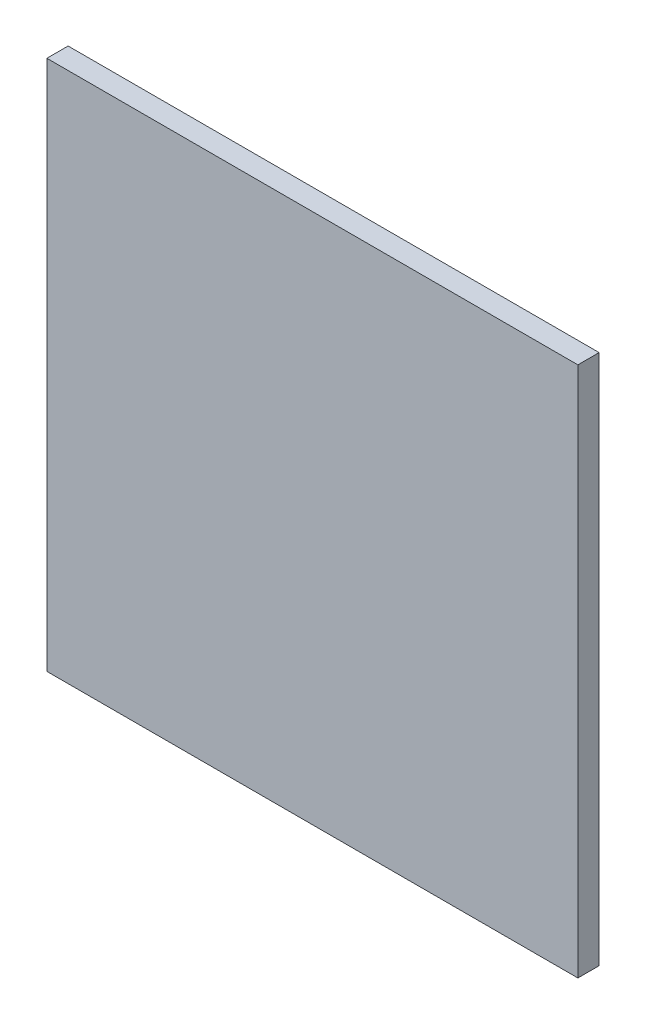
ISO-10303-21;
HEADER;
FILE_DESCRIPTION(('STEP AP214'),'2;1');
FILE_NAME('part.step','',(''),(''),'','','');
FILE_SCHEMA(('AUTOMOTIVE_DESIGN { 1 0 10303 214 1 1 1 1 }'));
ENDSEC;
DATA;
#1=APPLICATION_CONTEXT('core data for automotive mechanical design processes');
#2=APPLICATION_PROTOCOL_DEFINITION('international standard','automotive_design',2000,#1);
#3=PRODUCT_CONTEXT('',#1,'mechanical');
#4=PRODUCT('Part','Part','',(#3));
#5=PRODUCT_RELATED_PRODUCT_CATEGORY('part','',(#4));
#6=PRODUCT_DEFINITION_FORMATION('','',#4);
#7=PRODUCT_DEFINITION_CONTEXT('part definition',#1,'design');
#8=PRODUCT_DEFINITION('design','',#6,#7);
#9=PRODUCT_DEFINITION_SHAPE('','',#8);
#10=(LENGTH_UNIT() NAMED_UNIT(*) SI_UNIT(.MILLI.,.METRE.));
#11=(NAMED_UNIT(*) PLANE_ANGLE_UNIT() SI_UNIT($,.RADIAN.));
#12=(NAMED_UNIT(*) SI_UNIT($,.STERADIAN.) SOLID_ANGLE_UNIT());
#13=UNCERTAINTY_MEASURE_WITH_UNIT(LENGTH_MEASURE(1.E-05),#10,'distance_accuracy_value','');
#14=(GEOMETRIC_REPRESENTATION_CONTEXT(3) GLOBAL_UNCERTAINTY_ASSIGNED_CONTEXT((#13)) GLOBAL_UNIT_ASSIGNED_CONTEXT((#10,
#11,#12)) REPRESENTATION_CONTEXT('',''));
#15=CARTESIAN_POINT('',(0.,0.,0.));
#16=DIRECTION('',(0.,0.,1.));
#17=DIRECTION('',(1.,0.,0.));
#18=AXIS2_PLACEMENT_3D('',#15,#16,#17);
#19=CARTESIAN_POINT('',(-23.3223245614035,15.2333157894737,1.2));
#20=DIRECTION('',(1.,0.,0.));
#21=DIRECTION('',(0.,0.,-1.));
#22=AXIS2_PLACEMENT_3D('',#19,#20,#21);
#23=PLANE('',#22);
#24=DIRECTION('',(0.,-1.,0.));
#25=VECTOR('',#24,1.);
#26=CARTESIAN_POINT('',(-23.3223245614035,15.2333157894737,0.));
#27=LINE('',#26,#25);
#28=CARTESIAN_POINT('',(-23.3223245614035,15.2333157894737,0.));
#29=VERTEX_POINT('',#28);
#30=CARTESIAN_POINT('',(-23.3223245614035,-14.7666842105263,0.));
#31=VERTEX_POINT('',#30);
#32=EDGE_CURVE('E107',#29,#31,#27,.T.);
#33=ORIENTED_EDGE('',*,*,#32,.T.);
#34=DIRECTION('',(0.,0.,-1.));
#35=VECTOR('',#34,1.);
#36=CARTESIAN_POINT('',(-23.3223245614035,-14.7666842105263,1.2));
#37=LINE('',#36,#35);
#38=CARTESIAN_POINT('',(-23.3223245614035,-14.7666842105263,1.2));
#39=VERTEX_POINT('',#38);
#40=EDGE_CURVE('E11',#39,#31,#37,.T.);
#41=ORIENTED_EDGE('',*,*,#40,.F.);
#42=DIRECTION('',(0.,-1.,0.));
#43=VECTOR('',#42,1.);
#44=CARTESIAN_POINT('',(-23.3223245614035,15.2333157894737,1.2));
#45=LINE('',#44,#43);
#46=CARTESIAN_POINT('',(-23.3223245614035,15.2333157894737,1.2));
#47=VERTEX_POINT('',#46);
#48=EDGE_CURVE('E91',#47,#39,#45,.T.);
#49=ORIENTED_EDGE('',*,*,#48,.F.);
#50=DIRECTION('',(0.,0.,-1.));
#51=VECTOR('',#50,1.);
#52=CARTESIAN_POINT('',(-23.3223245614035,15.2333157894737,1.2));
#53=LINE('',#52,#51);
#54=EDGE_CURVE('E103',#47,#29,#53,.T.);
#55=ORIENTED_EDGE('',*,*,#54,.T.);
#56=EDGE_LOOP('',(#33,#41,#49,#55));
#57=FACE_BOUND('',#56,.T.);
#58=ADVANCED_FACE('F39',(#57),#23,.F.);
#59=CARTESIAN_POINT('',(-23.3223245614035,-14.7666842105263,1.2));
#60=DIRECTION('',(0.,1.,0.));
#61=DIRECTION('',(0.,0.,1.));
#62=AXIS2_PLACEMENT_3D('',#59,#60,#61);
#63=PLANE('',#62);
#64=DIRECTION('',(1.,0.,0.));
#65=VECTOR('',#64,1.);
#66=CARTESIAN_POINT('',(-23.3223245614035,-14.7666842105263,0.));
#67=LINE('',#66,#65);
#68=CARTESIAN_POINT('',(6.67767543859649,-14.7666842105263,0.));
#69=VERTEX_POINT('',#68);
#70=EDGE_CURVE('E96',#31,#69,#67,.T.);
#71=ORIENTED_EDGE('',*,*,#70,.T.);
#72=DIRECTION('',(0.,0.,-1.));
#73=VECTOR('',#72,1.);
#74=CARTESIAN_POINT('',(6.67767543859649,-14.7666842105263,1.2));
#75=LINE('',#74,#73);
#76=CARTESIAN_POINT('',(6.67767543859649,-14.7666842105263,1.2));
#77=VERTEX_POINT('',#76);
#78=EDGE_CURVE('E48',#77,#69,#75,.T.);
#79=ORIENTED_EDGE('',*,*,#78,.F.);
#80=DIRECTION('',(1.,0.,0.));
#81=VECTOR('',#80,1.);
#82=CARTESIAN_POINT('',(-23.3223245614035,-14.7666842105263,1.2));
#83=LINE('',#82,#81);
#84=EDGE_CURVE('E86',#39,#77,#83,.T.);
#85=ORIENTED_EDGE('',*,*,#84,.F.);
#86=ORIENTED_EDGE('',*,*,#40,.T.);
#87=EDGE_LOOP('',(#71,#79,#85,#86));
#88=FACE_BOUND('',#87,.T.);
#89=ADVANCED_FACE('F95',(#88),#63,.F.);
#90=CARTESIAN_POINT('',(6.67767543859649,15.2333157894737,1.2));
#91=DIRECTION('',(-1.,0.,0.));
#92=DIRECTION('',(0.,-1.,0.));
#93=AXIS2_PLACEMENT_3D('',#90,#91,#92);
#94=PLANE('',#93);
#95=DIRECTION('',(0.,1.,0.));
#96=VECTOR('',#95,1.);
#97=CARTESIAN_POINT('',(6.67767543859649,15.2333157894737,0.));
#98=LINE('',#97,#96);
#99=CARTESIAN_POINT('',(6.67767543859649,15.2333157894737,0.));
#100=VERTEX_POINT('',#99);
#101=EDGE_CURVE('E73',#69,#100,#98,.T.);
#102=ORIENTED_EDGE('',*,*,#101,.T.);
#103=DIRECTION('',(0.,0.,-1.));
#104=VECTOR('',#103,1.);
#105=CARTESIAN_POINT('',(6.67767543859649,15.2333157894737,1.2));
#106=LINE('',#105,#104);
#107=CARTESIAN_POINT('',(6.67767543859649,15.2333157894737,1.2));
#108=VERTEX_POINT('',#107);
#109=EDGE_CURVE('E98',#108,#100,#106,.T.);
#110=ORIENTED_EDGE('',*,*,#109,.F.);
#111=DIRECTION('',(0.,1.,0.));
#112=VECTOR('',#111,1.);
#113=CARTESIAN_POINT('',(6.67767543859649,15.2333157894737,1.2));
#114=LINE('',#113,#112);
#115=EDGE_CURVE('E89',#77,#108,#114,.T.);
#116=ORIENTED_EDGE('',*,*,#115,.F.);
#117=ORIENTED_EDGE('',*,*,#78,.T.);
#118=EDGE_LOOP('',(#102,#110,#116,#117));
#119=FACE_BOUND('',#118,.T.);
#120=ADVANCED_FACE('F99',(#119),#94,.F.);
#121=CARTESIAN_POINT('',(-23.3223245614035,15.2333157894737,1.2));
#122=DIRECTION('',(0.,-1.,0.));
#123=DIRECTION('',(0.,0.,-1.));
#124=AXIS2_PLACEMENT_3D('',#121,#122,#123);
#125=PLANE('',#124);
#126=DIRECTION('',(-1.,0.,0.));
#127=VECTOR('',#126,1.);
#128=CARTESIAN_POINT('',(-23.3223245614035,15.2333157894737,0.));
#129=LINE('',#128,#127);
#130=EDGE_CURVE('E79',#100,#29,#129,.T.);
#131=ORIENTED_EDGE('',*,*,#130,.T.);
#132=ORIENTED_EDGE('',*,*,#54,.F.);
#133=DIRECTION('',(-1.,0.,0.));
#134=VECTOR('',#133,1.);
#135=CARTESIAN_POINT('',(-23.3223245614035,15.2333157894737,1.2));
#136=LINE('',#135,#134);
#137=EDGE_CURVE('E56',#108,#47,#136,.T.);
#138=ORIENTED_EDGE('',*,*,#137,.F.);
#139=ORIENTED_EDGE('',*,*,#109,.T.);
#140=EDGE_LOOP('',(#131,#132,#138,#139));
#141=FACE_BOUND('',#140,.T.);
#142=ADVANCED_FACE('F120',(#141),#125,.F.);
#143=CARTESIAN_POINT('',(0.,0.,1.2));
#144=DIRECTION('',(0.,0.,1.));
#145=DIRECTION('',(1.,0.,0.));
#146=AXIS2_PLACEMENT_3D('',#143,#144,#145);
#147=PLANE('',#146);
#148=ORIENTED_EDGE('',*,*,#48,.T.);
#149=ORIENTED_EDGE('',*,*,#84,.T.);
#150=ORIENTED_EDGE('',*,*,#115,.T.);
#151=ORIENTED_EDGE('',*,*,#137,.T.);
#152=EDGE_LOOP('',(#148,#149,#150,#151));
#153=FACE_BOUND('',#152,.T.);
#154=ADVANCED_FACE('F87',(#153),#147,.T.);
#155=CARTESIAN_POINT('',(0.,0.,0.));
#156=DIRECTION('',(0.,0.,1.));
#157=DIRECTION('',(1.,0.,0.));
#158=AXIS2_PLACEMENT_3D('',#155,#156,#157);
#159=PLANE('',#158);
#160=ORIENTED_EDGE('',*,*,#32,.F.);
#161=ORIENTED_EDGE('',*,*,#130,.F.);
#162=ORIENTED_EDGE('',*,*,#101,.F.);
#163=ORIENTED_EDGE('',*,*,#70,.F.);
#164=EDGE_LOOP('',(#160,#161,#162,#163));
#165=FACE_BOUND('',#164,.T.);
#166=ADVANCED_FACE('F123',(#165),#159,.F.);
#167=CLOSED_SHELL('',(#58,#89,#120,#142,#154,#166));
#168=MANIFOLD_SOLID_BREP('B2',#167);
#169=ADVANCED_BREP_SHAPE_REPRESENTATION('',(#18,#168),#14);
#170=SHAPE_DEFINITION_REPRESENTATION(#9,#169);
ENDSEC;
END-ISO-10303-21;
